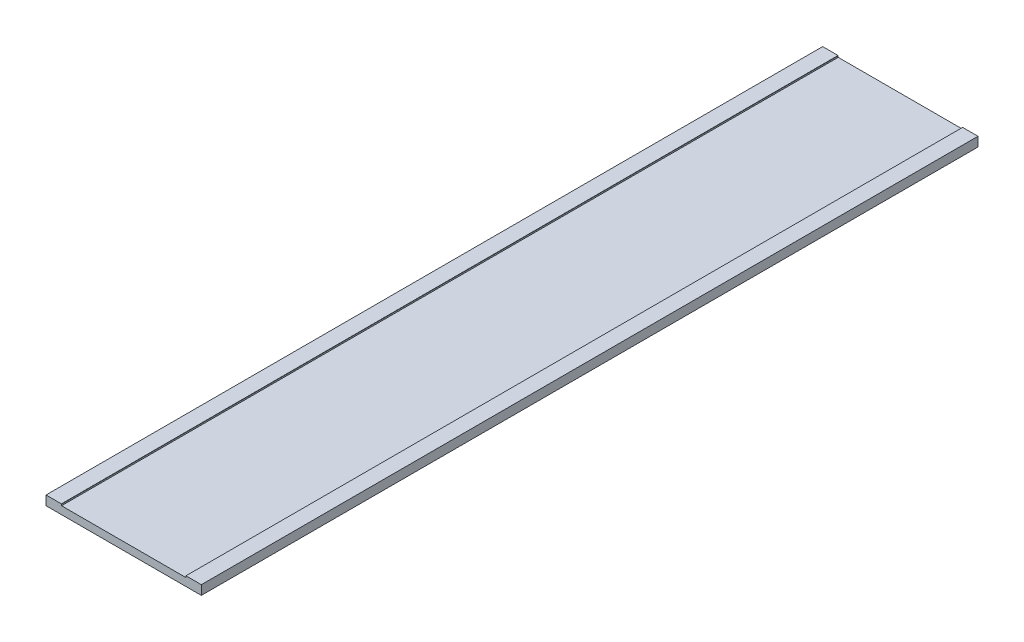
ISO-10303-21;
HEADER;
FILE_DESCRIPTION(('STEP AP214'),'2;1');
FILE_NAME('part.step','',(''),(''),'','','');
FILE_SCHEMA(('AUTOMOTIVE_DESIGN { 1 0 10303 214 1 1 1 1 }'));
ENDSEC;
DATA;
#1=APPLICATION_CONTEXT('core data for automotive mechanical design processes');
#2=APPLICATION_PROTOCOL_DEFINITION('international standard','automotive_design',2000,#1);
#3=PRODUCT_CONTEXT('',#1,'mechanical');
#4=PRODUCT('Part','Part','',(#3));
#5=PRODUCT_RELATED_PRODUCT_CATEGORY('part','',(#4));
#6=PRODUCT_DEFINITION_FORMATION('','',#4);
#7=PRODUCT_DEFINITION_CONTEXT('part definition',#1,'design');
#8=PRODUCT_DEFINITION('design','',#6,#7);
#9=PRODUCT_DEFINITION_SHAPE('','',#8);
#10=(LENGTH_UNIT() NAMED_UNIT(*) SI_UNIT(.MILLI.,.METRE.));
#11=(NAMED_UNIT(*) PLANE_ANGLE_UNIT() SI_UNIT($,.RADIAN.));
#12=(NAMED_UNIT(*) SI_UNIT($,.STERADIAN.) SOLID_ANGLE_UNIT());
#13=UNCERTAINTY_MEASURE_WITH_UNIT(LENGTH_MEASURE(1.E-05),#10,'distance_accuracy_value','');
#14=(GEOMETRIC_REPRESENTATION_CONTEXT(3) GLOBAL_UNCERTAINTY_ASSIGNED_CONTEXT((#13)) GLOBAL_UNIT_ASSIGNED_CONTEXT((#10,
#11,#12)) REPRESENTATION_CONTEXT('',''));
#15=CARTESIAN_POINT('',(0.,0.,0.));
#16=DIRECTION('',(0.,0.,1.));
#17=DIRECTION('',(1.,0.,0.));
#18=AXIS2_PLACEMENT_3D('',#15,#16,#17);
#19=CARTESIAN_POINT('',(9901.8546144561,0.,100000.));
#20=DIRECTION('',(0.,1.,0.));
#21=DIRECTION('',(0.,0.,1.));
#22=AXIS2_PLACEMENT_3D('',#19,#20,#21);
#23=PLANE('',#22);
#24=DIRECTION('',(1.,0.,0.));
#25=VECTOR('',#24,1.);
#26=CARTESIAN_POINT('',(9901.8546144561,0.,0.));
#27=LINE('',#26,#25);
#28=CARTESIAN_POINT('',(-10098.1453855439,0.,0.));
#29=VERTEX_POINT('',#28);
#30=CARTESIAN_POINT('',(9901.8546144561,0.,0.));
#31=VERTEX_POINT('',#30);
#32=EDGE_CURVE('E131',#29,#31,#27,.T.);
#33=ORIENTED_EDGE('',*,*,#32,.T.);
#34=DIRECTION('',(0.,0.,-1.));
#35=VECTOR('',#34,1.);
#36=CARTESIAN_POINT('',(9901.8546144561,0.,100000.));
#37=LINE('',#36,#35);
#38=CARTESIAN_POINT('',(9901.8546144561,0.,100000.));
#39=VERTEX_POINT('',#38);
#40=EDGE_CURVE('E113',#39,#31,#37,.T.);
#41=ORIENTED_EDGE('',*,*,#40,.F.);
#42=DIRECTION('',(1.,0.,0.));
#43=VECTOR('',#42,1.);
#44=CARTESIAN_POINT('',(9901.8546144561,0.,100000.));
#45=LINE('',#44,#43);
#46=CARTESIAN_POINT('',(-10098.1453855439,0.,100000.));
#47=VERTEX_POINT('',#46);
#48=EDGE_CURVE('E119',#47,#39,#45,.T.);
#49=ORIENTED_EDGE('',*,*,#48,.F.);
#50=DIRECTION('',(0.,0.,-1.));
#51=VECTOR('',#50,1.);
#52=CARTESIAN_POINT('',(-10098.1453855439,0.,100000.));
#53=LINE('',#52,#51);
#54=EDGE_CURVE('E176',#47,#29,#53,.T.);
#55=ORIENTED_EDGE('',*,*,#54,.T.);
#56=EDGE_LOOP('',(#33,#41,#49,#55));
#57=FACE_BOUND('',#56,.T.);
#58=ADVANCED_FACE('F32',(#57),#23,.F.);
#59=CARTESIAN_POINT('',(9901.8546144561,1200.,100000.));
#60=DIRECTION('',(-1.,0.,0.));
#61=DIRECTION('',(0.,0.,1.));
#62=AXIS2_PLACEMENT_3D('',#59,#60,#61);
#63=PLANE('',#62);
#64=DIRECTION('',(0.,1.,0.));
#65=VECTOR('',#64,1.);
#66=CARTESIAN_POINT('',(9901.8546144561,1200.,0.));
#67=LINE('',#66,#65);
#68=CARTESIAN_POINT('',(9901.8546144561,1200.,0.));
#69=VERTEX_POINT('',#68);
#70=EDGE_CURVE('E167',#31,#69,#67,.T.);
#71=ORIENTED_EDGE('',*,*,#70,.T.);
#72=DIRECTION('',(0.,0.,-1.));
#73=VECTOR('',#72,1.);
#74=CARTESIAN_POINT('',(9901.8546144561,1200.,100000.));
#75=LINE('',#74,#73);
#76=CARTESIAN_POINT('',(9901.8546144561,1200.,100000.));
#77=VERTEX_POINT('',#76);
#78=EDGE_CURVE('E116',#77,#69,#75,.T.);
#79=ORIENTED_EDGE('',*,*,#78,.F.);
#80=DIRECTION('',(0.,1.,0.));
#81=VECTOR('',#80,1.);
#82=CARTESIAN_POINT('',(9901.8546144561,1200.,100000.));
#83=LINE('',#82,#81);
#84=EDGE_CURVE('E109',#39,#77,#83,.T.);
#85=ORIENTED_EDGE('',*,*,#84,.F.);
#86=ORIENTED_EDGE('',*,*,#40,.T.);
#87=EDGE_LOOP('',(#71,#79,#85,#86));
#88=FACE_BOUND('',#87,.T.);
#89=ADVANCED_FACE('F111',(#88),#63,.F.);
#90=CARTESIAN_POINT('',(7901.8546144561,1200.,100000.));
#91=DIRECTION('',(0.,-1.,0.));
#92=DIRECTION('',(0.,0.,-1.));
#93=AXIS2_PLACEMENT_3D('',#90,#91,#92);
#94=PLANE('',#93);
#95=DIRECTION('',(-1.,0.,0.));
#96=VECTOR('',#95,1.);
#97=CARTESIAN_POINT('',(7901.8546144561,1200.,0.));
#98=LINE('',#97,#96);
#99=CARTESIAN_POINT('',(7921.8546144561,1200.,0.));
#100=VERTEX_POINT('',#99);
#101=EDGE_CURVE('E163',#69,#100,#98,.T.);
#102=ORIENTED_EDGE('',*,*,#101,.T.);
#103=DIRECTION('',(0.,0.,1.));
#104=VECTOR('',#103,1.);
#105=CARTESIAN_POINT('',(7921.8546144561,1200.,100000.));
#106=LINE('',#105,#104);
#107=CARTESIAN_POINT('',(7921.8546144561,1200.,100000.));
#108=VERTEX_POINT('',#107);
#109=EDGE_CURVE('E40',#100,#108,#106,.T.);
#110=ORIENTED_EDGE('',*,*,#109,.T.);
#111=DIRECTION('',(-1.,0.,0.));
#112=VECTOR('',#111,1.);
#113=CARTESIAN_POINT('',(7901.8546144561,1200.,100000.));
#114=LINE('',#113,#112);
#115=EDGE_CURVE('E118',#77,#108,#114,.T.);
#116=ORIENTED_EDGE('',*,*,#115,.F.);
#117=ORIENTED_EDGE('',*,*,#78,.T.);
#118=EDGE_LOOP('',(#102,#110,#116,#117));
#119=FACE_BOUND('',#118,.T.);
#120=ADVANCED_FACE('F199',(#119),#94,.F.);
#121=CARTESIAN_POINT('',(7901.8546144561,999.999999999998,100000.));
#122=DIRECTION('',(1.,0.,0.));
#123=DIRECTION('',(0.,0.,-1.));
#124=AXIS2_PLACEMENT_3D('',#121,#122,#123);
#125=PLANE('',#124);
#126=DIRECTION('',(0.,-1.,0.));
#127=VECTOR('',#126,1.);
#128=CARTESIAN_POINT('',(7901.8546144561,999.999999999998,100000.));
#129=LINE('',#128,#127);
#130=CARTESIAN_POINT('',(7901.8546144561,1180.,100000.));
#131=VERTEX_POINT('',#130);
#132=CARTESIAN_POINT('',(7901.8546144561,999.999999999998,100000.));
#133=VERTEX_POINT('',#132);
#134=EDGE_CURVE('E156',#131,#133,#129,.T.);
#135=ORIENTED_EDGE('',*,*,#134,.F.);
#136=DIRECTION('',(0.,0.,-1.));
#137=VECTOR('',#136,1.);
#138=CARTESIAN_POINT('',(7901.8546144561,1180.,100000.));
#139=LINE('',#138,#137);
#140=CARTESIAN_POINT('',(7901.8546144561,1180.,0.));
#141=VERTEX_POINT('',#140);
#142=EDGE_CURVE('E146',#131,#141,#139,.T.);
#143=ORIENTED_EDGE('',*,*,#142,.T.);
#144=DIRECTION('',(0.,-1.,0.));
#145=VECTOR('',#144,1.);
#146=CARTESIAN_POINT('',(7901.8546144561,999.999999999998,0.));
#147=LINE('',#146,#145);
#148=CARTESIAN_POINT('',(7901.8546144561,999.999999999998,0.));
#149=VERTEX_POINT('',#148);
#150=EDGE_CURVE('E154',#141,#149,#147,.T.);
#151=ORIENTED_EDGE('',*,*,#150,.T.);
#152=DIRECTION('',(0.,0.,-1.));
#153=VECTOR('',#152,1.);
#154=CARTESIAN_POINT('',(7901.8546144561,999.999999999998,100000.));
#155=LINE('',#154,#153);
#156=EDGE_CURVE('E137',#133,#149,#155,.T.);
#157=ORIENTED_EDGE('',*,*,#156,.F.);
#158=EDGE_LOOP('',(#135,#143,#151,#157));
#159=FACE_BOUND('',#158,.T.);
#160=ADVANCED_FACE('F152',(#159),#125,.F.);
#161=CARTESIAN_POINT('',(-8098.1453855439,999.999999999998,100000.));
#162=DIRECTION('',(0.,-1.,0.));
#163=DIRECTION('',(0.,0.,-1.));
#164=AXIS2_PLACEMENT_3D('',#161,#162,#163);
#165=PLANE('',#164);
#166=DIRECTION('',(-1.,0.,0.));
#167=VECTOR('',#166,1.);
#168=CARTESIAN_POINT('',(-8098.1453855439,999.999999999998,0.));
#169=LINE('',#168,#167);
#170=CARTESIAN_POINT('',(-8098.1453855439,999.999999999998,0.));
#171=VERTEX_POINT('',#170);
#172=EDGE_CURVE('E161',#149,#171,#169,.T.);
#173=ORIENTED_EDGE('',*,*,#172,.T.);
#174=DIRECTION('',(0.,0.,-1.));
#175=VECTOR('',#174,1.);
#176=CARTESIAN_POINT('',(-8098.1453855439,999.999999999998,100000.));
#177=LINE('',#176,#175);
#178=CARTESIAN_POINT('',(-8098.1453855439,999.999999999998,100000.));
#179=VERTEX_POINT('',#178);
#180=EDGE_CURVE('E181',#179,#171,#177,.T.);
#181=ORIENTED_EDGE('',*,*,#180,.F.);
#182=DIRECTION('',(-1.,0.,0.));
#183=VECTOR('',#182,1.);
#184=CARTESIAN_POINT('',(0.,999.999999999998,100000.));
#185=LINE('',#184,#183);
#186=EDGE_CURVE('E187',#133,#179,#185,.T.);
#187=ORIENTED_EDGE('',*,*,#186,.F.);
#188=ORIENTED_EDGE('',*,*,#156,.T.);
#189=EDGE_LOOP('',(#173,#181,#187,#188));
#190=FACE_BOUND('',#189,.T.);
#191=ADVANCED_FACE('F185',(#190),#165,.F.);
#192=CARTESIAN_POINT('',(-8098.1453855439,1200.,100000.));
#193=DIRECTION('',(-1.,0.,0.));
#194=DIRECTION('',(0.,0.,1.));
#195=AXIS2_PLACEMENT_3D('',#192,#193,#194);
#196=PLANE('',#195);
#197=DIRECTION('',(0.,1.,0.));
#198=VECTOR('',#197,1.);
#199=CARTESIAN_POINT('',(-8098.1453855439,1200.,0.));
#200=LINE('',#199,#198);
#201=CARTESIAN_POINT('',(-8098.1453855439,1180.,0.));
#202=VERTEX_POINT('',#201);
#203=EDGE_CURVE('E165',#171,#202,#200,.T.);
#204=ORIENTED_EDGE('',*,*,#203,.T.);
#205=DIRECTION('',(0.,0.,1.));
#206=VECTOR('',#205,1.);
#207=CARTESIAN_POINT('',(-8098.1453855439,1180.,100000.));
#208=LINE('',#207,#206);
#209=CARTESIAN_POINT('',(-8098.1453855439,1180.,100000.));
#210=VERTEX_POINT('',#209);
#211=EDGE_CURVE('E142',#202,#210,#208,.T.);
#212=ORIENTED_EDGE('',*,*,#211,.T.);
#213=DIRECTION('',(0.,1.,0.));
#214=VECTOR('',#213,1.);
#215=CARTESIAN_POINT('',(-8098.1453855439,1200.,100000.));
#216=LINE('',#215,#214);
#217=EDGE_CURVE('E190',#179,#210,#216,.T.);
#218=ORIENTED_EDGE('',*,*,#217,.F.);
#219=ORIENTED_EDGE('',*,*,#180,.T.);
#220=EDGE_LOOP('',(#204,#212,#218,#219));
#221=FACE_BOUND('',#220,.T.);
#222=ADVANCED_FACE('F219',(#221),#196,.F.);
#223=CARTESIAN_POINT('',(-10098.1453855439,1200.,100000.));
#224=DIRECTION('',(0.,-1.,0.));
#225=DIRECTION('',(0.,0.,-1.));
#226=AXIS2_PLACEMENT_3D('',#223,#224,#225);
#227=PLANE('',#226);
#228=DIRECTION('',(-1.,0.,0.));
#229=VECTOR('',#228,1.);
#230=CARTESIAN_POINT('',(-10098.1453855439,1200.,100000.));
#231=LINE('',#230,#229);
#232=CARTESIAN_POINT('',(-8118.1453855439,1200.,100000.));
#233=VERTEX_POINT('',#232);
#234=CARTESIAN_POINT('',(-10098.1453855439,1200.,100000.));
#235=VERTEX_POINT('',#234);
#236=EDGE_CURVE('E192',#233,#235,#231,.T.);
#237=ORIENTED_EDGE('',*,*,#236,.F.);
#238=DIRECTION('',(0.,0.,-1.));
#239=VECTOR('',#238,1.);
#240=CARTESIAN_POINT('',(-8118.1453855439,1200.,100000.));
#241=LINE('',#240,#239);
#242=CARTESIAN_POINT('',(-8118.1453855439,1200.,0.));
#243=VERTEX_POINT('',#242);
#244=EDGE_CURVE('E132',#233,#243,#241,.T.);
#245=ORIENTED_EDGE('',*,*,#244,.T.);
#246=DIRECTION('',(-1.,0.,0.));
#247=VECTOR('',#246,1.);
#248=CARTESIAN_POINT('',(-10098.1453855439,1200.,0.));
#249=LINE('',#248,#247);
#250=CARTESIAN_POINT('',(-10098.1453855439,1200.,0.));
#251=VERTEX_POINT('',#250);
#252=EDGE_CURVE('E173',#243,#251,#249,.T.);
#253=ORIENTED_EDGE('',*,*,#252,.T.);
#254=DIRECTION('',(0.,0.,-1.));
#255=VECTOR('',#254,1.);
#256=CARTESIAN_POINT('',(-10098.1453855439,1200.,100000.));
#257=LINE('',#256,#255);
#258=EDGE_CURVE('E178',#235,#251,#257,.T.);
#259=ORIENTED_EDGE('',*,*,#258,.F.);
#260=EDGE_LOOP('',(#237,#245,#253,#259));
#261=FACE_BOUND('',#260,.T.);
#262=ADVANCED_FACE('F222',(#261),#227,.F.);
#263=CARTESIAN_POINT('',(-10098.1453855439,0.,100000.));
#264=DIRECTION('',(1.,0.,0.));
#265=DIRECTION('',(0.,0.,-1.));
#266=AXIS2_PLACEMENT_3D('',#263,#264,#265);
#267=PLANE('',#266);
#268=DIRECTION('',(0.,-1.,0.));
#269=VECTOR('',#268,1.);
#270=CARTESIAN_POINT('',(-10098.1453855439,0.,0.));
#271=LINE('',#270,#269);
#272=EDGE_CURVE('E128',#251,#29,#271,.T.);
#273=ORIENTED_EDGE('',*,*,#272,.T.);
#274=ORIENTED_EDGE('',*,*,#54,.F.);
#275=DIRECTION('',(0.,-1.,0.));
#276=VECTOR('',#275,1.);
#277=CARTESIAN_POINT('',(-10098.1453855439,0.,100000.));
#278=LINE('',#277,#276);
#279=EDGE_CURVE('E124',#235,#47,#278,.T.);
#280=ORIENTED_EDGE('',*,*,#279,.F.);
#281=ORIENTED_EDGE('',*,*,#258,.T.);
#282=EDGE_LOOP('',(#273,#274,#280,#281));
#283=FACE_BOUND('',#282,.T.);
#284=ADVANCED_FACE('F226',(#283),#267,.F.);
#285=CARTESIAN_POINT('',(0.,0.,100000.));
#286=DIRECTION('',(0.,0.,-1.));
#287=DIRECTION('',(-1.,0.,0.));
#288=AXIS2_PLACEMENT_3D('',#285,#286,#287);
#289=PLANE('',#288);
#290=ORIENTED_EDGE('',*,*,#115,.T.);
#291=DIRECTION('',(0.707106781186548,0.707106781186548,0.));
#292=VECTOR('',#291,1.);
#293=CARTESIAN_POINT('',(7901.8546144561,1180.,100000.));
#294=LINE('',#293,#292);
#295=EDGE_CURVE('E11',#108,#131,#294,.F.);
#296=ORIENTED_EDGE('',*,*,#295,.T.);
#297=ORIENTED_EDGE('',*,*,#134,.T.);
#298=ORIENTED_EDGE('',*,*,#186,.T.);
#299=ORIENTED_EDGE('',*,*,#217,.T.);
#300=DIRECTION('',(0.707106781186548,-0.707106781186548,0.));
#301=VECTOR('',#300,1.);
#302=CARTESIAN_POINT('',(-8118.1453855439,1200.,100000.));
#303=LINE('',#302,#301);
#304=EDGE_CURVE('E144',#210,#233,#303,.F.);
#305=ORIENTED_EDGE('',*,*,#304,.T.);
#306=ORIENTED_EDGE('',*,*,#236,.T.);
#307=ORIENTED_EDGE('',*,*,#279,.T.);
#308=ORIENTED_EDGE('',*,*,#48,.T.);
#309=ORIENTED_EDGE('',*,*,#84,.T.);
#310=EDGE_LOOP('',(#290,#296,#297,#298,#299,#305,#306,#307,#308,#309));
#311=FACE_BOUND('',#310,.T.);
#312=ADVANCED_FACE('F122',(#311),#289,.F.);
#313=CARTESIAN_POINT('',(0.,0.,0.));
#314=DIRECTION('',(0.,0.,-1.));
#315=DIRECTION('',(-1.,0.,0.));
#316=AXIS2_PLACEMENT_3D('',#313,#314,#315);
#317=PLANE('',#316);
#318=ORIENTED_EDGE('',*,*,#150,.F.);
#319=DIRECTION('',(-0.707106781186548,-0.707106781186548,0.));
#320=VECTOR('',#319,1.);
#321=CARTESIAN_POINT('',(3360.92730722805,-3360.92730722805,0.));
#322=LINE('',#321,#320);
#323=EDGE_CURVE('E54',#141,#100,#322,.F.);
#324=ORIENTED_EDGE('',*,*,#323,.T.);
#325=ORIENTED_EDGE('',*,*,#101,.F.);
#326=ORIENTED_EDGE('',*,*,#70,.F.);
#327=ORIENTED_EDGE('',*,*,#32,.F.);
#328=ORIENTED_EDGE('',*,*,#272,.F.);
#329=ORIENTED_EDGE('',*,*,#252,.F.);
#330=DIRECTION('',(-0.707106781186548,0.707106781186548,0.));
#331=VECTOR('',#330,1.);
#332=CARTESIAN_POINT('',(-3459.07269277195,-3459.07269277195,0.));
#333=LINE('',#332,#331);
#334=EDGE_CURVE('E135',#243,#202,#333,.F.);
#335=ORIENTED_EDGE('',*,*,#334,.T.);
#336=ORIENTED_EDGE('',*,*,#203,.F.);
#337=ORIENTED_EDGE('',*,*,#172,.F.);
#338=EDGE_LOOP('',(#318,#324,#325,#326,#327,#328,#329,#335,#336,#337));
#339=FACE_BOUND('',#338,.T.);
#340=ADVANCED_FACE('F159',(#339),#317,.T.);
#341=CARTESIAN_POINT('',(-8118.1453855439,1200.,100000.));
#342=DIRECTION('',(-0.707106781186548,-0.707106781186548,0.));
#343=DIRECTION('',(0.,0.,-1.));
#344=AXIS2_PLACEMENT_3D('',#341,#342,#343);
#345=PLANE('',#344);
#346=ORIENTED_EDGE('',*,*,#304,.F.);
#347=ORIENTED_EDGE('',*,*,#211,.F.);
#348=ORIENTED_EDGE('',*,*,#334,.F.);
#349=ORIENTED_EDGE('',*,*,#244,.F.);
#350=EDGE_LOOP('',(#346,#347,#348,#349));
#351=FACE_BOUND('',#350,.T.);
#352=ADVANCED_FACE('F201',(#351),#345,.F.);
#353=CARTESIAN_POINT('',(7901.8546144561,1180.,100000.));
#354=DIRECTION('',(0.707106781186548,-0.707106781186548,0.));
#355=DIRECTION('',(0.,0.,-1.));
#356=AXIS2_PLACEMENT_3D('',#353,#354,#355);
#357=PLANE('',#356);
#358=ORIENTED_EDGE('',*,*,#295,.F.);
#359=ORIENTED_EDGE('',*,*,#109,.F.);
#360=ORIENTED_EDGE('',*,*,#323,.F.);
#361=ORIENTED_EDGE('',*,*,#142,.F.);
#362=EDGE_LOOP('',(#358,#359,#360,#361));
#363=FACE_BOUND('',#362,.T.);
#364=ADVANCED_FACE('F34',(#363),#357,.F.);
#365=CLOSED_SHELL('',(#58,#89,#120,#160,#191,#222,#262,#284,#312,#340,#352,#364));
#366=MANIFOLD_SOLID_BREP('B2',#365);
#367=ADVANCED_BREP_SHAPE_REPRESENTATION('',(#18,#366),#14);
#368=SHAPE_DEFINITION_REPRESENTATION(#9,#367);
ENDSEC;
END-ISO-10303-21;
